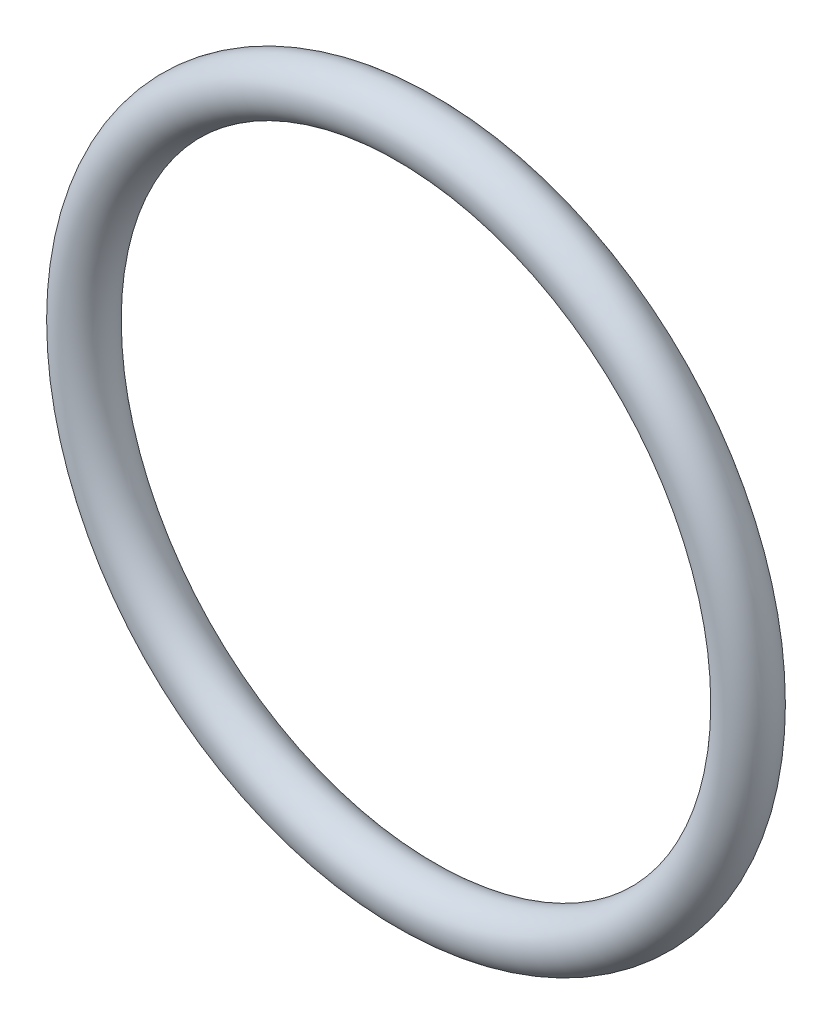
ISO-10303-21;
HEADER;
FILE_DESCRIPTION(('STEP AP214'),'2;1');
FILE_NAME('part.step','',(''),(''),'','','');
FILE_SCHEMA(('AUTOMOTIVE_DESIGN { 1 0 10303 214 1 1 1 1 }'));
ENDSEC;
DATA;
#1=APPLICATION_CONTEXT('core data for automotive mechanical design processes');
#2=APPLICATION_PROTOCOL_DEFINITION('international standard','automotive_design',2000,#1);
#3=PRODUCT_CONTEXT('',#1,'mechanical');
#4=PRODUCT('Part','Part','',(#3));
#5=PRODUCT_RELATED_PRODUCT_CATEGORY('part','',(#4));
#6=PRODUCT_DEFINITION_FORMATION('','',#4);
#7=PRODUCT_DEFINITION_CONTEXT('part definition',#1,'design');
#8=PRODUCT_DEFINITION('design','',#6,#7);
#9=PRODUCT_DEFINITION_SHAPE('','',#8);
#10=(LENGTH_UNIT() NAMED_UNIT(*) SI_UNIT(.MILLI.,.METRE.));
#11=(NAMED_UNIT(*) PLANE_ANGLE_UNIT() SI_UNIT($,.RADIAN.));
#12=(NAMED_UNIT(*) SI_UNIT($,.STERADIAN.) SOLID_ANGLE_UNIT());
#13=UNCERTAINTY_MEASURE_WITH_UNIT(LENGTH_MEASURE(1.E-05),#10,'distance_accuracy_value','');
#14=(GEOMETRIC_REPRESENTATION_CONTEXT(3) GLOBAL_UNCERTAINTY_ASSIGNED_CONTEXT((#13)) GLOBAL_UNIT_ASSIGNED_CONTEXT((#10,
#11,#12)) REPRESENTATION_CONTEXT('',''));
#15=CARTESIAN_POINT('',(0.,0.,0.));
#16=DIRECTION('',(0.,0.,1.));
#17=DIRECTION('',(1.,0.,0.));
#18=AXIS2_PLACEMENT_3D('',#15,#16,#17);
#19=CARTESIAN_POINT('',(0.,0.,0.));
#20=DIRECTION('',(0.,0.,1.));
#21=DIRECTION('',(1.,0.,0.));
#22=AXIS2_PLACEMENT_3D('',#19,#20,#21);
#23=TOROIDAL_SURFACE('',#22,22.1996,1.76530000000001);
#24=CARTESIAN_POINT('',(23.9649,0.,0.));
#25=VERTEX_POINT('',#24);
#26=VERTEX_LOOP('',#25);
#27=FACE_BOUND('',#26,.T.);
#28=ADVANCED_FACE('F28',(#27),#23,.T.);
#29=CLOSED_SHELL('',(#28));
#30=MANIFOLD_SOLID_BREP('B2',#29);
#31=ADVANCED_BREP_SHAPE_REPRESENTATION('',(#18,#30),#14);
#32=SHAPE_DEFINITION_REPRESENTATION(#9,#31);
ENDSEC;
END-ISO-10303-21;
